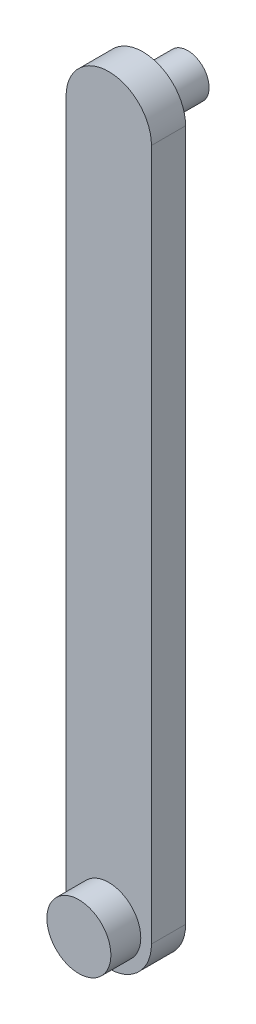
ISO-10303-21;
HEADER;
FILE_DESCRIPTION(('STEP AP214'),'2;1');
FILE_NAME('part.step','',(''),(''),'','','');
FILE_SCHEMA(('AUTOMOTIVE_DESIGN { 1 0 10303 214 1 1 1 1 }'));
ENDSEC;
DATA;
#1=APPLICATION_CONTEXT('core data for automotive mechanical design processes');
#2=APPLICATION_PROTOCOL_DEFINITION('international standard','automotive_design',2000,#1);
#3=PRODUCT_CONTEXT('',#1,'mechanical');
#4=PRODUCT('Part','Part','',(#3));
#5=PRODUCT_RELATED_PRODUCT_CATEGORY('part','',(#4));
#6=PRODUCT_DEFINITION_FORMATION('','',#4);
#7=PRODUCT_DEFINITION_CONTEXT('part definition',#1,'design');
#8=PRODUCT_DEFINITION('design','',#6,#7);
#9=PRODUCT_DEFINITION_SHAPE('','',#8);
#10=(LENGTH_UNIT() NAMED_UNIT(*) SI_UNIT(.MILLI.,.METRE.));
#11=(NAMED_UNIT(*) PLANE_ANGLE_UNIT() SI_UNIT($,.RADIAN.));
#12=(NAMED_UNIT(*) SI_UNIT($,.STERADIAN.) SOLID_ANGLE_UNIT());
#13=UNCERTAINTY_MEASURE_WITH_UNIT(LENGTH_MEASURE(1.E-05),#10,'distance_accuracy_value','');
#14=(GEOMETRIC_REPRESENTATION_CONTEXT(3) GLOBAL_UNCERTAINTY_ASSIGNED_CONTEXT((#13)) GLOBAL_UNIT_ASSIGNED_CONTEXT((#10,
#11,#12)) REPRESENTATION_CONTEXT('',''));
#15=CARTESIAN_POINT('',(0.,0.,0.));
#16=DIRECTION('',(0.,0.,1.));
#17=DIRECTION('',(1.,0.,0.));
#18=AXIS2_PLACEMENT_3D('',#15,#16,#17);
#19=CARTESIAN_POINT('',(0.,0.,150.));
#20=DIRECTION('',(0.,0.,-1.));
#21=DIRECTION('',(-1.,0.,0.));
#22=AXIS2_PLACEMENT_3D('',#19,#20,#21);
#23=CYLINDRICAL_SURFACE('',#22,75.);
#24=CARTESIAN_POINT('',(0.,0.,150.));
#25=DIRECTION('',(0.,0.,1.));
#26=DIRECTION('',(1.,0.,0.));
#27=AXIS2_PLACEMENT_3D('',#24,#25,#26);
#28=CIRCLE('',#27,75.);
#29=CARTESIAN_POINT('',(75.,0.,150.));
#30=VERTEX_POINT('',#29);
#31=EDGE_CURVE('E11',#30,#30,#28,.T.);
#32=ORIENTED_EDGE('',*,*,#31,.F.);
#33=EDGE_LOOP('',(#32));
#34=FACE_BOUND('',#33,.T.);
#35=CARTESIAN_POINT('',(0.,0.,0.));
#36=DIRECTION('',(0.,0.,1.));
#37=DIRECTION('',(1.,0.,0.));
#38=AXIS2_PLACEMENT_3D('',#35,#36,#37);
#39=CIRCLE('',#38,75.);
#40=CARTESIAN_POINT('',(75.,0.,0.));
#41=VERTEX_POINT('',#40);
#42=EDGE_CURVE('E44',#41,#41,#39,.T.);
#43=ORIENTED_EDGE('',*,*,#42,.T.);
#44=EDGE_LOOP('',(#43));
#45=FACE_BOUND('',#44,.T.);
#46=ADVANCED_FACE('F41',(#34,#45),#23,.T.);
#47=CARTESIAN_POINT('',(0.,0.,150.));
#48=DIRECTION('',(0.,0.,1.));
#49=DIRECTION('',(1.,0.,0.));
#50=AXIS2_PLACEMENT_3D('',#47,#48,#49);
#51=PLANE('',#50);
#52=ORIENTED_EDGE('',*,*,#31,.T.);
#53=EDGE_LOOP('',(#52));
#54=FACE_BOUND('',#53,.T.);
#55=ADVANCED_FACE('F56',(#54),#51,.T.);
#56=CARTESIAN_POINT('',(0.,0.,0.));
#57=DIRECTION('',(0.,0.,1.));
#58=DIRECTION('',(1.,0.,0.));
#59=AXIS2_PLACEMENT_3D('',#56,#57,#58);
#60=PLANE('',#59);
#61=ORIENTED_EDGE('',*,*,#42,.F.);
#62=EDGE_LOOP('',(#61));
#63=FACE_BOUND('',#62,.T.);
#64=ADVANCED_FACE('F54',(#63),#60,.F.);
#65=CLOSED_SHELL('',(#46,#55,#64));
#66=MANIFOLD_SOLID_BREP('B2',#65);
#67=CARTESIAN_POINT('',(0.,0.,80.));
#68=DIRECTION('',(0.,0.,1.));
#69=DIRECTION('',(1.,0.,0.));
#70=AXIS2_PLACEMENT_3D('',#67,#68,#69);
#71=PLANE('',#70);
#72=CARTESIAN_POINT('',(0.,0.,80.));
#73=DIRECTION('',(0.,0.,1.));
#74=DIRECTION('',(1.,0.,0.));
#75=AXIS2_PLACEMENT_3D('',#72,#73,#74);
#76=CIRCLE('',#75,100.);
#77=CARTESIAN_POINT('',(-100.,0.,80.));
#78=VERTEX_POINT('',#77);
#79=CARTESIAN_POINT('',(100.,0.,80.));
#80=VERTEX_POINT('',#79);
#81=EDGE_CURVE('E134',#78,#80,#76,.T.);
#82=ORIENTED_EDGE('',*,*,#81,.T.);
#83=DIRECTION('',(0.,1.,0.));
#84=VECTOR('',#83,1.);
#85=CARTESIAN_POINT('',(100.,0.,80.));
#86=LINE('',#85,#84);
#87=CARTESIAN_POINT('',(100.,1620.,80.));
#88=VERTEX_POINT('',#87);
#89=EDGE_CURVE('E129',#80,#88,#86,.T.);
#90=ORIENTED_EDGE('',*,*,#89,.T.);
#91=CARTESIAN_POINT('',(0.,1620.,80.));
#92=DIRECTION('',(0.,0.,1.));
#93=DIRECTION('',(1.,0.,0.));
#94=AXIS2_PLACEMENT_3D('',#91,#92,#93);
#95=CIRCLE('',#94,100.);
#96=CARTESIAN_POINT('',(-100.,1620.,80.));
#97=VERTEX_POINT('',#96);
#98=EDGE_CURVE('E132',#88,#97,#95,.T.);
#99=ORIENTED_EDGE('',*,*,#98,.T.);
#100=DIRECTION('',(0.,-1.,0.));
#101=VECTOR('',#100,1.);
#102=CARTESIAN_POINT('',(-100.,0.,80.));
#103=LINE('',#102,#101);
#104=EDGE_CURVE('E99',#97,#78,#103,.T.);
#105=ORIENTED_EDGE('',*,*,#104,.T.);
#106=EDGE_LOOP('',(#82,#90,#99,#105));
#107=FACE_BOUND('',#106,.T.);
#108=CARTESIAN_POINT('',(0.,0.,80.));
#109=DIRECTION('',(0.,0.,1.));
#110=DIRECTION('',(1.,0.,0.));
#111=AXIS2_PLACEMENT_3D('',#108,#109,#110);
#112=CIRCLE('',#111,75.);
#113=CARTESIAN_POINT('',(75.,0.,80.));
#114=VERTEX_POINT('',#113);
#115=EDGE_CURVE('E149',#114,#114,#112,.T.);
#116=ORIENTED_EDGE('',*,*,#115,.F.);
#117=EDGE_LOOP('',(#116));
#118=FACE_BOUND('',#117,.T.);
#119=ADVANCED_FACE('F82',(#107,#118),#71,.T.);
#120=CARTESIAN_POINT('',(0.,0.,0.));
#121=DIRECTION('',(0.,0.,1.));
#122=DIRECTION('',(1.,0.,0.));
#123=AXIS2_PLACEMENT_3D('',#120,#121,#122);
#124=PLANE('',#123);
#125=CARTESIAN_POINT('',(0.,0.,0.));
#126=DIRECTION('',(0.,0.,1.));
#127=DIRECTION('',(1.,0.,0.));
#128=AXIS2_PLACEMENT_3D('',#125,#126,#127);
#129=CIRCLE('',#128,100.);
#130=CARTESIAN_POINT('',(-100.,0.,0.));
#131=VERTEX_POINT('',#130);
#132=CARTESIAN_POINT('',(100.,0.,0.));
#133=VERTEX_POINT('',#132);
#134=EDGE_CURVE('E146',#131,#133,#129,.T.);
#135=ORIENTED_EDGE('',*,*,#134,.F.);
#136=DIRECTION('',(0.,-1.,0.));
#137=VECTOR('',#136,1.);
#138=CARTESIAN_POINT('',(-100.,0.,0.));
#139=LINE('',#138,#137);
#140=CARTESIAN_POINT('',(-100.,1620.,0.));
#141=VERTEX_POINT('',#140);
#142=EDGE_CURVE('E122',#141,#131,#139,.T.);
#143=ORIENTED_EDGE('',*,*,#142,.F.);
#144=CARTESIAN_POINT('',(0.,1620.,0.));
#145=DIRECTION('',(0.,0.,1.));
#146=DIRECTION('',(1.,0.,0.));
#147=AXIS2_PLACEMENT_3D('',#144,#145,#146);
#148=CIRCLE('',#147,100.);
#149=CARTESIAN_POINT('',(100.,1620.,0.));
#150=VERTEX_POINT('',#149);
#151=EDGE_CURVE('E116',#150,#141,#148,.T.);
#152=ORIENTED_EDGE('',*,*,#151,.F.);
#153=DIRECTION('',(0.,1.,0.));
#154=VECTOR('',#153,1.);
#155=CARTESIAN_POINT('',(100.,0.,0.));
#156=LINE('',#155,#154);
#157=EDGE_CURVE('E138',#133,#150,#156,.T.);
#158=ORIENTED_EDGE('',*,*,#157,.F.);
#159=EDGE_LOOP('',(#135,#143,#152,#158));
#160=FACE_BOUND('',#159,.T.);
#161=CARTESIAN_POINT('',(0.,1620.,0.));
#162=DIRECTION('',(0.,0.,1.));
#163=DIRECTION('',(1.,0.,0.));
#164=AXIS2_PLACEMENT_3D('',#161,#162,#163);
#165=CIRCLE('',#164,50.);
#166=CARTESIAN_POINT('',(50.,1620.,0.));
#167=VERTEX_POINT('',#166);
#168=EDGE_CURVE('E164',#167,#167,#165,.F.);
#169=ORIENTED_EDGE('',*,*,#168,.F.);
#170=EDGE_LOOP('',(#169));
#171=FACE_BOUND('',#170,.T.);
#172=CARTESIAN_POINT('',(0.,0.,0.));
#173=DIRECTION('',(0.,0.,1.));
#174=DIRECTION('',(1.,0.,0.));
#175=AXIS2_PLACEMENT_3D('',#172,#173,#174);
#176=CIRCLE('',#175,75.);
#177=CARTESIAN_POINT('',(75.,0.,0.));
#178=VERTEX_POINT('',#177);
#179=EDGE_CURVE('E161',#178,#178,#176,.T.);
#180=ORIENTED_EDGE('',*,*,#179,.T.);
#181=EDGE_LOOP('',(#180));
#182=FACE_BOUND('',#181,.T.);
#183=ADVANCED_FACE('F157',(#160,#171,#182),#124,.F.);
#184=CARTESIAN_POINT('',(0.,0.,80.));
#185=DIRECTION('',(0.,0.,-1.));
#186=DIRECTION('',(-1.,0.,0.));
#187=AXIS2_PLACEMENT_3D('',#184,#185,#186);
#188=CYLINDRICAL_SURFACE('',#187,100.);
#189=ORIENTED_EDGE('',*,*,#134,.T.);
#190=DIRECTION('',(0.,0.,-1.));
#191=VECTOR('',#190,1.);
#192=CARTESIAN_POINT('',(100.,0.,80.));
#193=LINE('',#192,#191);
#194=EDGE_CURVE('E39',#80,#133,#193,.T.);
#195=ORIENTED_EDGE('',*,*,#194,.F.);
#196=ORIENTED_EDGE('',*,*,#81,.F.);
#197=DIRECTION('',(0.,0.,-1.));
#198=VECTOR('',#197,1.);
#199=CARTESIAN_POINT('',(-100.,0.,80.));
#200=LINE('',#199,#198);
#201=EDGE_CURVE('E142',#78,#131,#200,.T.);
#202=ORIENTED_EDGE('',*,*,#201,.T.);
#203=EDGE_LOOP('',(#189,#195,#196,#202));
#204=FACE_BOUND('',#203,.T.);
#205=ADVANCED_FACE('F84',(#204),#188,.T.);
#206=CARTESIAN_POINT('',(100.,0.,80.));
#207=DIRECTION('',(-1.,0.,0.));
#208=DIRECTION('',(0.,0.,1.));
#209=AXIS2_PLACEMENT_3D('',#206,#207,#208);
#210=PLANE('',#209);
#211=ORIENTED_EDGE('',*,*,#157,.T.);
#212=DIRECTION('',(0.,0.,-1.));
#213=VECTOR('',#212,1.);
#214=CARTESIAN_POINT('',(100.,1620.,80.));
#215=LINE('',#214,#213);
#216=EDGE_CURVE('E91',#88,#150,#215,.T.);
#217=ORIENTED_EDGE('',*,*,#216,.F.);
#218=ORIENTED_EDGE('',*,*,#89,.F.);
#219=ORIENTED_EDGE('',*,*,#194,.T.);
#220=EDGE_LOOP('',(#211,#217,#218,#219));
#221=FACE_BOUND('',#220,.T.);
#222=ADVANCED_FACE('F137',(#221),#210,.F.);
#223=CARTESIAN_POINT('',(0.,1620.,80.));
#224=DIRECTION('',(0.,0.,-1.));
#225=DIRECTION('',(-1.,0.,0.));
#226=AXIS2_PLACEMENT_3D('',#223,#224,#225);
#227=CYLINDRICAL_SURFACE('',#226,100.);
#228=ORIENTED_EDGE('',*,*,#151,.T.);
#229=DIRECTION('',(0.,0.,-1.));
#230=VECTOR('',#229,1.);
#231=CARTESIAN_POINT('',(-100.,1620.,80.));
#232=LINE('',#231,#230);
#233=EDGE_CURVE('E139',#97,#141,#232,.T.);
#234=ORIENTED_EDGE('',*,*,#233,.F.);
#235=ORIENTED_EDGE('',*,*,#98,.F.);
#236=ORIENTED_EDGE('',*,*,#216,.T.);
#237=EDGE_LOOP('',(#228,#234,#235,#236));
#238=FACE_BOUND('',#237,.T.);
#239=ADVANCED_FACE('F140',(#238),#227,.T.);
#240=CARTESIAN_POINT('',(-100.,0.,80.));
#241=DIRECTION('',(1.,0.,0.));
#242=DIRECTION('',(0.,0.,-1.));
#243=AXIS2_PLACEMENT_3D('',#240,#241,#242);
#244=PLANE('',#243);
#245=ORIENTED_EDGE('',*,*,#142,.T.);
#246=ORIENTED_EDGE('',*,*,#201,.F.);
#247=ORIENTED_EDGE('',*,*,#104,.F.);
#248=ORIENTED_EDGE('',*,*,#233,.T.);
#249=EDGE_LOOP('',(#245,#246,#247,#248));
#250=FACE_BOUND('',#249,.T.);
#251=ADVANCED_FACE('F154',(#250),#244,.F.);
#252=CARTESIAN_POINT('',(0.,0.,80.));
#253=DIRECTION('',(0.,0.,-1.));
#254=DIRECTION('',(-1.,0.,0.));
#255=AXIS2_PLACEMENT_3D('',#252,#253,#254);
#256=CYLINDRICAL_SURFACE('',#255,75.);
#257=ORIENTED_EDGE('',*,*,#115,.T.);
#258=EDGE_LOOP('',(#257));
#259=FACE_BOUND('',#258,.T.);
#260=ORIENTED_EDGE('',*,*,#179,.F.);
#261=EDGE_LOOP('',(#260));
#262=FACE_BOUND('',#261,.T.);
#263=ADVANCED_FACE('F182',(#259,#262),#256,.F.);
#264=CARTESIAN_POINT('',(0.,1620.,221.42135623731));
#265=DIRECTION('',(0.,0.,-1.));
#266=DIRECTION('',(-1.,0.,0.));
#267=AXIS2_PLACEMENT_3D('',#264,#265,#266);
#268=CYLINDRICAL_SURFACE('',#267,50.);
#269=CARTESIAN_POINT('',(0.,1620.,-105.));
#270=DIRECTION('',(0.,0.,1.));
#271=DIRECTION('',(1.,0.,0.));
#272=AXIS2_PLACEMENT_3D('',#269,#270,#271);
#273=CIRCLE('',#272,50.);
#274=CARTESIAN_POINT('',(50.,1620.,-105.));
#275=VERTEX_POINT('',#274);
#276=EDGE_CURVE('E169',#275,#275,#273,.T.);
#277=ORIENTED_EDGE('',*,*,#276,.T.);
#278=EDGE_LOOP('',(#277));
#279=FACE_BOUND('',#278,.T.);
#280=ORIENTED_EDGE('',*,*,#168,.T.);
#281=EDGE_LOOP('',(#280));
#282=FACE_BOUND('',#281,.T.);
#283=ADVANCED_FACE('F173',(#279,#282),#268,.T.);
#284=CARTESIAN_POINT('',(0.,1620.,-105.));
#285=DIRECTION('',(0.,0.,1.));
#286=DIRECTION('',(1.,0.,0.));
#287=AXIS2_PLACEMENT_3D('',#284,#285,#286);
#288=PLANE('',#287);
#289=ORIENTED_EDGE('',*,*,#276,.F.);
#290=EDGE_LOOP('',(#289));
#291=FACE_BOUND('',#290,.T.);
#292=ADVANCED_FACE('F176',(#291),#288,.F.);
#293=CLOSED_SHELL('',(#119,#183,#205,#222,#239,#251,#263,#283,#292));
#294=MANIFOLD_SOLID_BREP('B6',#293);
#295=ADVANCED_BREP_SHAPE_REPRESENTATION('',(#18,#66,#294),#14);
#296=SHAPE_DEFINITION_REPRESENTATION(#9,#295);
ENDSEC;
END-ISO-10303-21;
